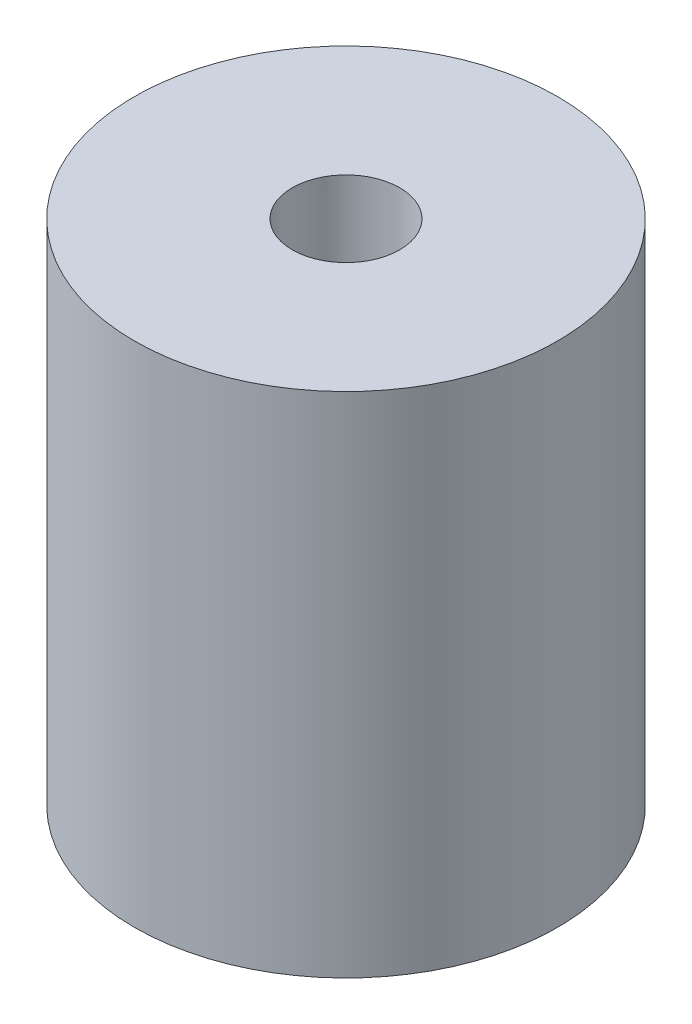
ISO-10303-21;
HEADER;
FILE_DESCRIPTION(('STEP AP214'),'2;1');
FILE_NAME('part.step','',(''),(''),'','','');
FILE_SCHEMA(('AUTOMOTIVE_DESIGN { 1 0 10303 214 1 1 1 1 }'));
ENDSEC;
DATA;
#1=APPLICATION_CONTEXT('core data for automotive mechanical design processes');
#2=APPLICATION_PROTOCOL_DEFINITION('international standard','automotive_design',2000,#1);
#3=PRODUCT_CONTEXT('',#1,'mechanical');
#4=PRODUCT('Part','Part','',(#3));
#5=PRODUCT_RELATED_PRODUCT_CATEGORY('part','',(#4));
#6=PRODUCT_DEFINITION_FORMATION('','',#4);
#7=PRODUCT_DEFINITION_CONTEXT('part definition',#1,'design');
#8=PRODUCT_DEFINITION('design','',#6,#7);
#9=PRODUCT_DEFINITION_SHAPE('','',#8);
#10=(LENGTH_UNIT() NAMED_UNIT(*) SI_UNIT(.MILLI.,.METRE.));
#11=(NAMED_UNIT(*) PLANE_ANGLE_UNIT() SI_UNIT($,.RADIAN.));
#12=(NAMED_UNIT(*) SI_UNIT($,.STERADIAN.) SOLID_ANGLE_UNIT());
#13=UNCERTAINTY_MEASURE_WITH_UNIT(LENGTH_MEASURE(1.E-05),#10,'distance_accuracy_value','');
#14=(GEOMETRIC_REPRESENTATION_CONTEXT(3) GLOBAL_UNCERTAINTY_ASSIGNED_CONTEXT((#13)) GLOBAL_UNIT_ASSIGNED_CONTEXT((#10,
#11,#12)) REPRESENTATION_CONTEXT('',''));
#15=CARTESIAN_POINT('',(0.,0.,0.));
#16=DIRECTION('',(0.,0.,1.));
#17=DIRECTION('',(1.,0.,0.));
#18=AXIS2_PLACEMENT_3D('',#15,#16,#17);
#19=CARTESIAN_POINT('',(0.,30.,0.));
#20=DIRECTION('',(0.,-1.,0.));
#21=DIRECTION('',(0.,0.,-1.));
#22=AXIS2_PLACEMENT_3D('',#19,#20,#21);
#23=CYLINDRICAL_SURFACE('',#22,3.175);
#24=CARTESIAN_POINT('',(0.,30.,0.));
#25=DIRECTION('',(0.,1.,0.));
#26=DIRECTION('',(0.,0.,1.));
#27=AXIS2_PLACEMENT_3D('',#24,#25,#26);
#28=CIRCLE('',#27,3.175);
#29=CARTESIAN_POINT('',(0.,30.,3.175));
#30=VERTEX_POINT('',#29);
#31=EDGE_CURVE('E43',#30,#30,#28,.T.);
#32=ORIENTED_EDGE('',*,*,#31,.T.);
#33=EDGE_LOOP('',(#32));
#34=FACE_BOUND('',#33,.T.);
#35=CARTESIAN_POINT('',(0.,15.,0.));
#36=DIRECTION('',(0.,-1.,0.));
#37=DIRECTION('',(0.,0.,-1.));
#38=AXIS2_PLACEMENT_3D('',#35,#36,#37);
#39=CIRCLE('',#38,3.175);
#40=CARTESIAN_POINT('',(0.,15.,-3.175));
#41=VERTEX_POINT('',#40);
#42=EDGE_CURVE('E34',#41,#41,#39,.T.);
#43=ORIENTED_EDGE('',*,*,#42,.T.);
#44=EDGE_LOOP('',(#43));
#45=FACE_BOUND('',#44,.T.);
#46=ADVANCED_FACE('F30',(#34,#45),#23,.F.);
#47=CARTESIAN_POINT('',(0.,30.,0.));
#48=DIRECTION('',(0.,1.,0.));
#49=DIRECTION('',(0.,0.,1.));
#50=AXIS2_PLACEMENT_3D('',#47,#48,#49);
#51=PLANE('',#50);
#52=CARTESIAN_POINT('',(0.,30.,0.));
#53=DIRECTION('',(0.,1.,0.));
#54=DIRECTION('',(0.,0.,1.));
#55=AXIS2_PLACEMENT_3D('',#52,#53,#54);
#56=CIRCLE('',#55,12.5);
#57=CARTESIAN_POINT('',(0.,30.,12.5));
#58=VERTEX_POINT('',#57);
#59=EDGE_CURVE('E10',#58,#58,#56,.T.);
#60=ORIENTED_EDGE('',*,*,#59,.T.);
#61=EDGE_LOOP('',(#60));
#62=FACE_BOUND('',#61,.T.);
#63=ORIENTED_EDGE('',*,*,#31,.F.);
#64=EDGE_LOOP('',(#63));
#65=FACE_BOUND('',#64,.T.);
#66=ADVANCED_FACE('F68',(#62,#65),#51,.T.);
#67=CARTESIAN_POINT('',(0.,0.,0.));
#68=DIRECTION('',(0.,1.,0.));
#69=DIRECTION('',(0.,0.,1.));
#70=AXIS2_PLACEMENT_3D('',#67,#68,#69);
#71=PLANE('',#70);
#72=CARTESIAN_POINT('',(0.,0.,0.));
#73=DIRECTION('',(0.,-1.,0.));
#74=DIRECTION('',(0.,0.,-1.));
#75=AXIS2_PLACEMENT_3D('',#72,#73,#74);
#76=CIRCLE('',#75,6.35);
#77=CARTESIAN_POINT('',(0.,0.,-6.35));
#78=VERTEX_POINT('',#77);
#79=EDGE_CURVE('E47',#78,#78,#76,.T.);
#80=ORIENTED_EDGE('',*,*,#79,.F.);
#81=EDGE_LOOP('',(#80));
#82=FACE_BOUND('',#81,.T.);
#83=CARTESIAN_POINT('',(0.,0.,0.));
#84=DIRECTION('',(0.,1.,0.));
#85=DIRECTION('',(0.,0.,1.));
#86=AXIS2_PLACEMENT_3D('',#83,#84,#85);
#87=CIRCLE('',#86,12.5);
#88=CARTESIAN_POINT('',(0.,0.,12.5));
#89=VERTEX_POINT('',#88);
#90=EDGE_CURVE('E38',#89,#89,#87,.T.);
#91=ORIENTED_EDGE('',*,*,#90,.F.);
#92=EDGE_LOOP('',(#91));
#93=FACE_BOUND('',#92,.T.);
#94=ADVANCED_FACE('F74',(#82,#93),#71,.F.);
#95=CARTESIAN_POINT('',(0.,30.,0.));
#96=DIRECTION('',(0.,-1.,0.));
#97=DIRECTION('',(0.,0.,-1.));
#98=AXIS2_PLACEMENT_3D('',#95,#96,#97);
#99=CYLINDRICAL_SURFACE('',#98,12.5);
#100=ORIENTED_EDGE('',*,*,#59,.F.);
#101=EDGE_LOOP('',(#100));
#102=FACE_BOUND('',#101,.T.);
#103=ORIENTED_EDGE('',*,*,#90,.T.);
#104=EDGE_LOOP('',(#103));
#105=FACE_BOUND('',#104,.T.);
#106=ADVANCED_FACE('F32',(#102,#105),#99,.T.);
#107=CARTESIAN_POINT('',(0.,15.,0.));
#108=DIRECTION('',(0.,-1.,0.));
#109=DIRECTION('',(0.,0.,-1.));
#110=AXIS2_PLACEMENT_3D('',#107,#108,#109);
#111=CYLINDRICAL_SURFACE('',#110,6.35);
#112=CARTESIAN_POINT('',(0.,15.,0.));
#113=DIRECTION('',(0.,-1.,0.));
#114=DIRECTION('',(0.,0.,-1.));
#115=AXIS2_PLACEMENT_3D('',#112,#113,#114);
#116=CIRCLE('',#115,6.35);
#117=CARTESIAN_POINT('',(0.,15.,-6.35));
#118=VERTEX_POINT('',#117);
#119=EDGE_CURVE('E50',#118,#118,#116,.T.);
#120=ORIENTED_EDGE('',*,*,#119,.F.);
#121=EDGE_LOOP('',(#120));
#122=FACE_BOUND('',#121,.T.);
#123=ORIENTED_EDGE('',*,*,#79,.T.);
#124=EDGE_LOOP('',(#123));
#125=FACE_BOUND('',#124,.T.);
#126=ADVANCED_FACE('F60',(#122,#125),#111,.F.);
#127=CARTESIAN_POINT('',(0.,15.,0.));
#128=DIRECTION('',(0.,-1.,0.));
#129=DIRECTION('',(0.,0.,-1.));
#130=AXIS2_PLACEMENT_3D('',#127,#128,#129);
#131=PLANE('',#130);
#132=ORIENTED_EDGE('',*,*,#42,.F.);
#133=EDGE_LOOP('',(#132));
#134=FACE_BOUND('',#133,.T.);
#135=ORIENTED_EDGE('',*,*,#119,.T.);
#136=EDGE_LOOP('',(#135));
#137=FACE_BOUND('',#136,.T.);
#138=ADVANCED_FACE('F58',(#134,#137),#131,.T.);
#139=CLOSED_SHELL('',(#46,#66,#94,#106,#126,#138));
#140=MANIFOLD_SOLID_BREP('B2',#139);
#141=ADVANCED_BREP_SHAPE_REPRESENTATION('',(#18,#140),#14);
#142=SHAPE_DEFINITION_REPRESENTATION(#9,#141);
ENDSEC;
END-ISO-10303-21;
